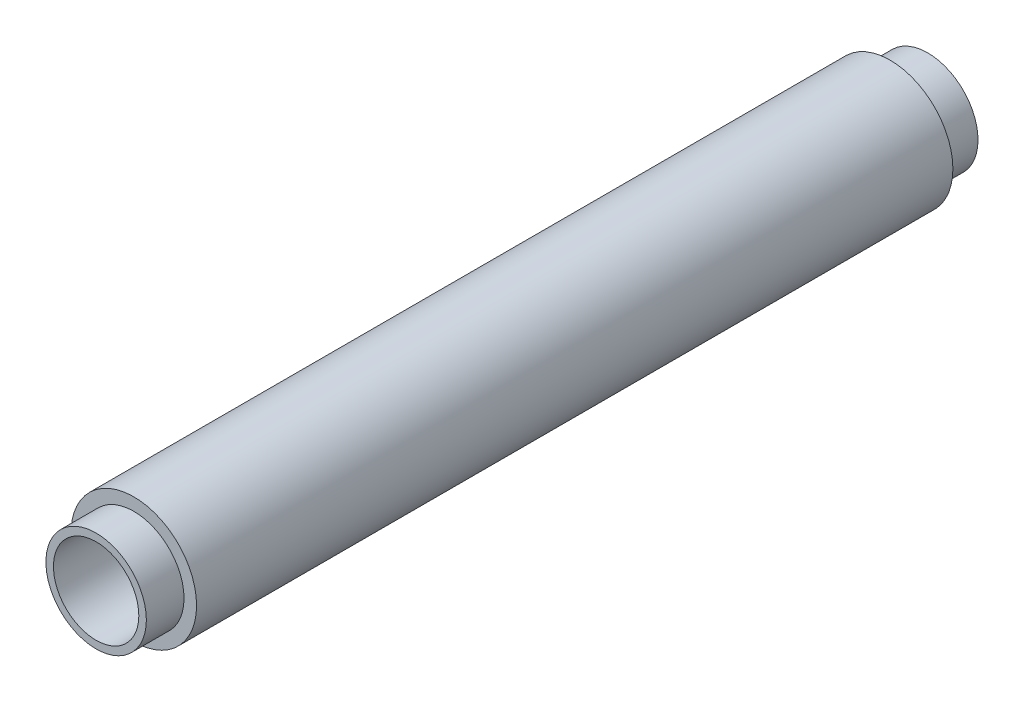
ISO-10303-21;
HEADER;
FILE_DESCRIPTION(('STEP AP214'),'2;1');
FILE_NAME('part.step','',(''),(''),'','','');
FILE_SCHEMA(('AUTOMOTIVE_DESIGN { 1 0 10303 214 1 1 1 1 }'));
ENDSEC;
DATA;
#1=APPLICATION_CONTEXT('core data for automotive mechanical design processes');
#2=APPLICATION_PROTOCOL_DEFINITION('international standard','automotive_design',2000,#1);
#3=PRODUCT_CONTEXT('',#1,'mechanical');
#4=PRODUCT('Part','Part','',(#3));
#5=PRODUCT_RELATED_PRODUCT_CATEGORY('part','',(#4));
#6=PRODUCT_DEFINITION_FORMATION('','',#4);
#7=PRODUCT_DEFINITION_CONTEXT('part definition',#1,'design');
#8=PRODUCT_DEFINITION('design','',#6,#7);
#9=PRODUCT_DEFINITION_SHAPE('','',#8);
#10=(LENGTH_UNIT() NAMED_UNIT(*) SI_UNIT(.MILLI.,.METRE.));
#11=(NAMED_UNIT(*) PLANE_ANGLE_UNIT() SI_UNIT($,.RADIAN.));
#12=(NAMED_UNIT(*) SI_UNIT($,.STERADIAN.) SOLID_ANGLE_UNIT());
#13=UNCERTAINTY_MEASURE_WITH_UNIT(LENGTH_MEASURE(1.E-05),#10,'distance_accuracy_value','');
#14=(GEOMETRIC_REPRESENTATION_CONTEXT(3) GLOBAL_UNCERTAINTY_ASSIGNED_CONTEXT((#13)) GLOBAL_UNIT_ASSIGNED_CONTEXT((#10,
#11,#12)) REPRESENTATION_CONTEXT('',''));
#15=CARTESIAN_POINT('',(0.,0.,0.));
#16=DIRECTION('',(0.,0.,1.));
#17=DIRECTION('',(1.,0.,0.));
#18=AXIS2_PLACEMENT_3D('',#15,#16,#17);
#19=CARTESIAN_POINT('',(3.27515792264421E-12,0.,1000.));
#20=DIRECTION('',(0.,0.,1.));
#21=DIRECTION('',(1.,0.,0.));
#22=AXIS2_PLACEMENT_3D('',#19,#20,#21);
#23=CYLINDRICAL_SURFACE('',#22,25.0000000000003);
#24=CARTESIAN_POINT('',(4.02455846426619E-13,2.22044604925031E-13,150.6));
#25=DIRECTION('',(0.,0.,1.));
#26=DIRECTION('',(1.,0.,0.));
#27=AXIS2_PLACEMENT_3D('',#24,#25,#26);
#28=CIRCLE('',#27,25.0000000000005);
#29=CARTESIAN_POINT('',(25.0000000000009,2.2065682614425E-13,150.6));
#30=VERTEX_POINT('',#29);
#31=EDGE_CURVE('E69',#30,#30,#28,.T.);
#32=ORIENTED_EDGE('',*,*,#31,.F.);
#33=EDGE_LOOP('',(#32));
#34=FACE_BOUND('',#33,.T.);
#35=CARTESIAN_POINT('',(-6.86950496486816E-13,-1.11022302462516E-13,-150.6));
#36=DIRECTION('',(0.,0.,1.));
#37=DIRECTION('',(1.,0.,0.));
#38=AXIS2_PLACEMENT_3D('',#35,#36,#37);
#39=CIRCLE('',#38,25.0000000000005);
#40=CARTESIAN_POINT('',(24.9999999999998,-1.12410081243297E-13,-150.6));
#41=VERTEX_POINT('',#40);
#42=EDGE_CURVE('E87',#41,#41,#39,.T.);
#43=ORIENTED_EDGE('',*,*,#42,.T.);
#44=EDGE_LOOP('',(#43));
#45=FACE_BOUND('',#44,.T.);
#46=ADVANCED_FACE('F50',(#34,#45),#23,.T.);
#47=CARTESIAN_POINT('',(3.27515792264421E-12,0.,1000.));
#48=DIRECTION('',(0.,0.,1.));
#49=DIRECTION('',(1.,0.,0.));
#50=AXIS2_PLACEMENT_3D('',#47,#48,#49);
#51=CYLINDRICAL_SURFACE('',#50,17.0000000000003);
#52=CARTESIAN_POINT('',(4.23272528138341E-13,2.22044604925031E-13,165.6));
#53=DIRECTION('',(0.,0.,1.));
#54=DIRECTION('',(1.,0.,0.));
#55=AXIS2_PLACEMENT_3D('',#52,#53,#54);
#56=CIRCLE('',#55,17.0000000000006);
#57=CARTESIAN_POINT('',(17.000000000001,2.211009153541E-13,165.6));
#58=VERTEX_POINT('',#57);
#59=EDGE_CURVE('E12',#58,#58,#56,.T.);
#60=ORIENTED_EDGE('',*,*,#59,.T.);
#61=EDGE_LOOP('',(#60));
#62=FACE_BOUND('',#61,.T.);
#63=CARTESIAN_POINT('',(-7.0082828429463E-13,0.,-165.6));
#64=DIRECTION('',(0.,0.,1.));
#65=DIRECTION('',(1.,0.,0.));
#66=AXIS2_PLACEMENT_3D('',#63,#64,#65);
#67=CIRCLE('',#66,17.0000000000006);
#68=CARTESIAN_POINT('',(16.9999999999999,0.,-165.6));
#69=VERTEX_POINT('',#68);
#70=EDGE_CURVE('E75',#69,#69,#67,.T.);
#71=ORIENTED_EDGE('',*,*,#70,.F.);
#72=EDGE_LOOP('',(#71));
#73=FACE_BOUND('',#72,.T.);
#74=ADVANCED_FACE('F106',(#62,#73),#51,.F.);
#75=CARTESIAN_POINT('',(-20.0000000000003,2.22044604925031E-13,165.6));
#76=DIRECTION('',(0.,0.,-1.));
#77=DIRECTION('',(-1.,0.,0.));
#78=AXIS2_PLACEMENT_3D('',#75,#76,#77);
#79=PLANE('',#78);
#80=ORIENTED_EDGE('',*,*,#59,.F.);
#81=EDGE_LOOP('',(#80));
#82=FACE_BOUND('',#81,.T.);
#83=CARTESIAN_POINT('',(4.23272528138341E-13,2.22044604925031E-13,165.6));
#84=DIRECTION('',(0.,0.,1.));
#85=DIRECTION('',(1.,0.,0.));
#86=AXIS2_PLACEMENT_3D('',#83,#84,#85);
#87=CIRCLE('',#86,20.0000000000006);
#88=CARTESIAN_POINT('',(20.000000000001,2.20934381900406E-13,165.6));
#89=VERTEX_POINT('',#88);
#90=EDGE_CURVE('E57',#89,#89,#87,.T.);
#91=ORIENTED_EDGE('',*,*,#90,.T.);
#92=EDGE_LOOP('',(#91));
#93=FACE_BOUND('',#92,.T.);
#94=ADVANCED_FACE('F111',(#82,#93),#79,.F.);
#95=CARTESIAN_POINT('',(3.27515792264421E-12,0.,1000.));
#96=DIRECTION('',(0.,0.,1.));
#97=DIRECTION('',(1.,0.,0.));
#98=AXIS2_PLACEMENT_3D('',#95,#96,#97);
#99=CYLINDRICAL_SURFACE('',#98,20.0000000000005);
#100=ORIENTED_EDGE('',*,*,#90,.F.);
#101=EDGE_LOOP('',(#100));
#102=FACE_BOUND('',#101,.T.);
#103=CARTESIAN_POINT('',(4.02455846426619E-13,2.22044604925031E-13,150.6));
#104=DIRECTION('',(0.,0.,1.));
#105=DIRECTION('',(1.,0.,0.));
#106=AXIS2_PLACEMENT_3D('',#103,#104,#105);
#107=CIRCLE('',#106,20.0000000000005);
#108=CARTESIAN_POINT('',(20.0000000000009,2.20934381900406E-13,150.6));
#109=VERTEX_POINT('',#108);
#110=EDGE_CURVE('E63',#109,#109,#107,.T.);
#111=ORIENTED_EDGE('',*,*,#110,.T.);
#112=EDGE_LOOP('',(#111));
#113=FACE_BOUND('',#112,.T.);
#114=ADVANCED_FACE('F116',(#102,#113),#99,.T.);
#115=CARTESIAN_POINT('',(-20.0000000000001,2.22044604925031E-13,150.6));
#116=DIRECTION('',(0.,0.,-1.));
#117=DIRECTION('',(-1.,0.,0.));
#118=AXIS2_PLACEMENT_3D('',#115,#116,#117);
#119=PLANE('',#118);
#120=ORIENTED_EDGE('',*,*,#110,.F.);
#121=EDGE_LOOP('',(#120));
#122=FACE_BOUND('',#121,.T.);
#123=ORIENTED_EDGE('',*,*,#31,.T.);
#124=EDGE_LOOP('',(#123));
#125=FACE_BOUND('',#124,.T.);
#126=ADVANCED_FACE('F114',(#122,#125),#119,.F.);
#127=CARTESIAN_POINT('',(-20.0000000000013,0.,-165.6));
#128=DIRECTION('',(0.,0.,1.));
#129=DIRECTION('',(-1.,0.,0.));
#130=AXIS2_PLACEMENT_3D('',#127,#128,#129);
#131=PLANE('',#130);
#132=ORIENTED_EDGE('',*,*,#70,.T.);
#133=EDGE_LOOP('',(#132));
#134=FACE_BOUND('',#133,.T.);
#135=CARTESIAN_POINT('',(-7.0082828429463E-13,0.,-165.6));
#136=DIRECTION('',(0.,0.,1.));
#137=DIRECTION('',(1.,0.,0.));
#138=AXIS2_PLACEMENT_3D('',#135,#136,#137);
#139=CIRCLE('',#138,20.0000000000006);
#140=CARTESIAN_POINT('',(19.9999999999999,0.,-165.6));
#141=VERTEX_POINT('',#140);
#142=EDGE_CURVE('E79',#141,#141,#139,.T.);
#143=ORIENTED_EDGE('',*,*,#142,.F.);
#144=EDGE_LOOP('',(#143));
#145=FACE_BOUND('',#144,.T.);
#146=ADVANCED_FACE('F102',(#134,#145),#131,.F.);
#147=CARTESIAN_POINT('',(-3.61516372393567E-12,0.,-1000.));
#148=DIRECTION('',(0.,0.,-1.));
#149=DIRECTION('',(1.,0.,0.));
#150=AXIS2_PLACEMENT_3D('',#147,#148,#149);
#151=CYLINDRICAL_SURFACE('',#150,20.0000000000005);
#152=ORIENTED_EDGE('',*,*,#142,.T.);
#153=EDGE_LOOP('',(#152));
#154=FACE_BOUND('',#153,.T.);
#155=CARTESIAN_POINT('',(-6.86950496486816E-13,-1.11022302462516E-13,-150.6));
#156=DIRECTION('',(0.,0.,1.));
#157=DIRECTION('',(1.,0.,0.));
#158=AXIS2_PLACEMENT_3D('',#155,#156,#157);
#159=CIRCLE('',#158,20.0000000000005);
#160=CARTESIAN_POINT('',(19.9999999999998,-1.12132525487141E-13,-150.6));
#161=VERTEX_POINT('',#160);
#162=EDGE_CURVE('E83',#161,#161,#159,.T.);
#163=ORIENTED_EDGE('',*,*,#162,.F.);
#164=EDGE_LOOP('',(#163));
#165=FACE_BOUND('',#164,.T.);
#166=ADVANCED_FACE('F96',(#154,#165),#151,.T.);
#167=CARTESIAN_POINT('',(-20.0000000000011,0.,-150.6));
#168=DIRECTION('',(0.,0.,1.));
#169=DIRECTION('',(-1.,0.,0.));
#170=AXIS2_PLACEMENT_3D('',#167,#168,#169);
#171=PLANE('',#170);
#172=ORIENTED_EDGE('',*,*,#162,.T.);
#173=EDGE_LOOP('',(#172));
#174=FACE_BOUND('',#173,.T.);
#175=ORIENTED_EDGE('',*,*,#42,.F.);
#176=EDGE_LOOP('',(#175));
#177=FACE_BOUND('',#176,.T.);
#178=ADVANCED_FACE('F94',(#174,#177),#171,.F.);
#179=CLOSED_SHELL('',(#46,#74,#94,#114,#126,#146,#166,#178));
#180=MANIFOLD_SOLID_BREP('B2',#179);
#181=ADVANCED_BREP_SHAPE_REPRESENTATION('',(#18,#180),#14);
#182=SHAPE_DEFINITION_REPRESENTATION(#9,#181);
ENDSEC;
END-ISO-10303-21;
